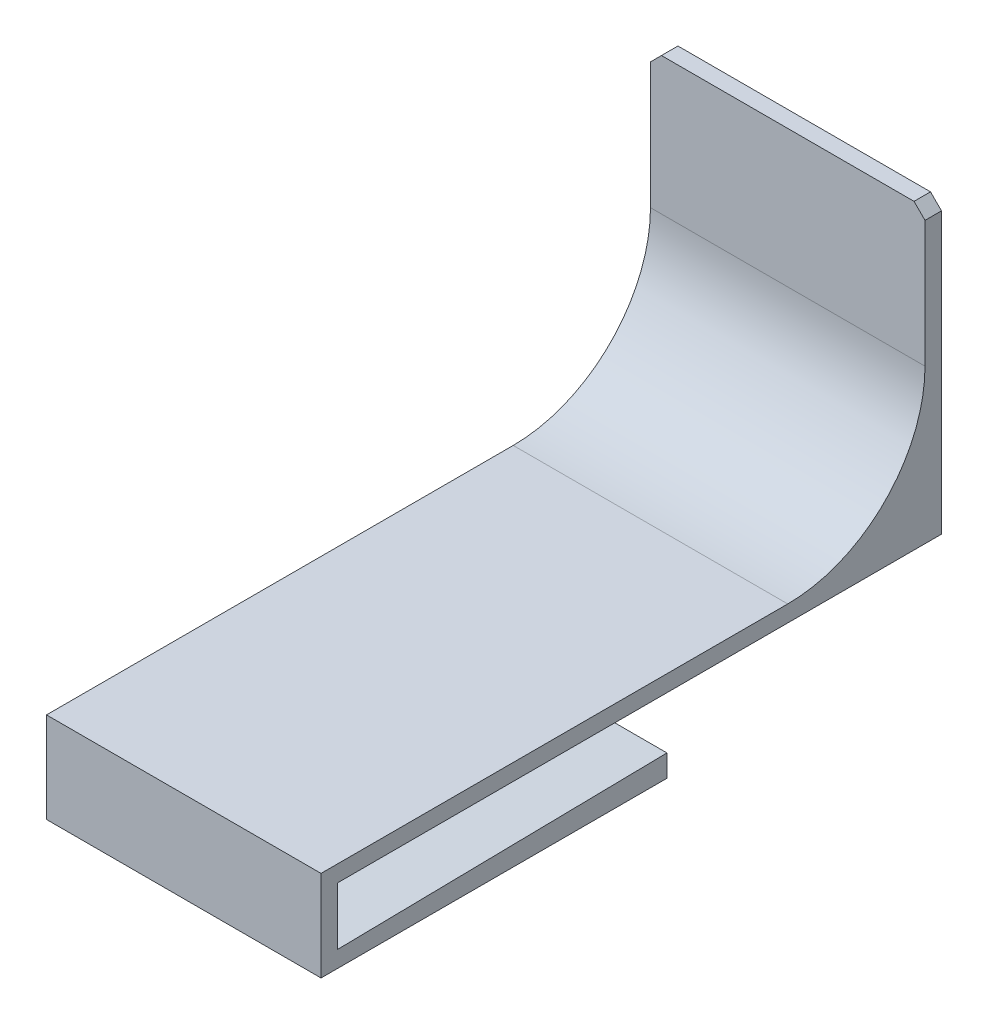
ISO-10303-21;
HEADER;
FILE_DESCRIPTION(('STEP AP214'),'2;1');
FILE_NAME('part.step','',(''),(''),'','','');
FILE_SCHEMA(('AUTOMOTIVE_DESIGN { 1 0 10303 214 1 1 1 1 }'));
ENDSEC;
DATA;
#1=APPLICATION_CONTEXT('core data for automotive mechanical design processes');
#2=APPLICATION_PROTOCOL_DEFINITION('international standard','automotive_design',2000,#1);
#3=PRODUCT_CONTEXT('',#1,'mechanical');
#4=PRODUCT('Part','Part','',(#3));
#5=PRODUCT_RELATED_PRODUCT_CATEGORY('part','',(#4));
#6=PRODUCT_DEFINITION_FORMATION('','',#4);
#7=PRODUCT_DEFINITION_CONTEXT('part definition',#1,'design');
#8=PRODUCT_DEFINITION('design','',#6,#7);
#9=PRODUCT_DEFINITION_SHAPE('','',#8);
#10=(LENGTH_UNIT() NAMED_UNIT(*) SI_UNIT(.MILLI.,.METRE.));
#11=(NAMED_UNIT(*) PLANE_ANGLE_UNIT() SI_UNIT($,.RADIAN.));
#12=(NAMED_UNIT(*) SI_UNIT($,.STERADIAN.) SOLID_ANGLE_UNIT());
#13=UNCERTAINTY_MEASURE_WITH_UNIT(LENGTH_MEASURE(1.E-05),#10,'distance_accuracy_value','');
#14=(GEOMETRIC_REPRESENTATION_CONTEXT(3) GLOBAL_UNCERTAINTY_ASSIGNED_CONTEXT((#13)) GLOBAL_UNIT_ASSIGNED_CONTEXT((#10,
#11,#12)) REPRESENTATION_CONTEXT('',''));
#15=CARTESIAN_POINT('',(0.,0.,0.));
#16=DIRECTION('',(0.,0.,1.));
#17=DIRECTION('',(1.,0.,0.));
#18=AXIS2_PLACEMENT_3D('',#15,#16,#17);
#19=CARTESIAN_POINT('',(25.,3.99999999999999,0.));
#20=DIRECTION('',(0.,0.,1.));
#21=DIRECTION('',(1.,0.,0.));
#22=AXIS2_PLACEMENT_3D('',#19,#20,#21);
#23=PLANE('',#22);
#24=DIRECTION('',(0.,1.,0.));
#25=VECTOR('',#24,1.);
#26=CARTESIAN_POINT('',(-25.,3.99999999999999,0.));
#27=LINE('',#26,#25);
#28=CARTESIAN_POINT('',(-25.,0.,0.));
#29=VERTEX_POINT('',#28);
#30=CARTESIAN_POINT('',(-25.,3.99999999999999,0.));
#31=VERTEX_POINT('',#30);
#32=EDGE_CURVE('E155',#29,#31,#27,.T.);
#33=ORIENTED_EDGE('',*,*,#32,.T.);
#34=DIRECTION('',(-1.,0.,0.));
#35=VECTOR('',#34,1.);
#36=CARTESIAN_POINT('',(25.,3.99999999999999,0.));
#37=LINE('',#36,#35);
#38=CARTESIAN_POINT('',(25.,3.99999999999999,0.));
#39=VERTEX_POINT('',#38);
#40=EDGE_CURVE('E154',#39,#31,#37,.T.);
#41=ORIENTED_EDGE('',*,*,#40,.F.);
#42=DIRECTION('',(0.,1.,0.));
#43=VECTOR('',#42,1.);
#44=CARTESIAN_POINT('',(25.,0.,0.));
#45=LINE('',#44,#43);
#46=CARTESIAN_POINT('',(25.,0.,0.));
#47=VERTEX_POINT('',#46);
#48=EDGE_CURVE('E139',#47,#39,#45,.T.);
#49=ORIENTED_EDGE('',*,*,#48,.F.);
#50=DIRECTION('',(-1.,0.,0.));
#51=VECTOR('',#50,1.);
#52=CARTESIAN_POINT('',(25.,0.,0.));
#53=LINE('',#52,#51);
#54=EDGE_CURVE('E193',#47,#29,#53,.T.);
#55=ORIENTED_EDGE('',*,*,#54,.T.);
#56=EDGE_LOOP('',(#33,#41,#49,#55));
#57=FACE_BOUND('',#56,.T.);
#58=ADVANCED_FACE('F39',(#57),#23,.F.);
#59=CARTESIAN_POINT('',(25.,2.99999999999999,60.));
#60=DIRECTION('',(0.,-0.9998611400396,-0.0166643523339933));
#61=DIRECTION('',(0.,0.0166643523339933,-0.9998611400396));
#62=AXIS2_PLACEMENT_3D('',#59,#60,#61);
#63=PLANE('',#62);
#64=DIRECTION('',(0.,-0.0166643523339933,0.9998611400396));
#65=VECTOR('',#64,1.);
#66=CARTESIAN_POINT('',(-25.,2.99999999999999,60.));
#67=LINE('',#66,#65);
#68=CARTESIAN_POINT('',(-25.,2.99999999999999,60.));
#69=VERTEX_POINT('',#68);
#70=EDGE_CURVE('E195',#31,#69,#67,.T.);
#71=ORIENTED_EDGE('',*,*,#70,.T.);
#72=DIRECTION('',(-1.,0.,0.));
#73=VECTOR('',#72,1.);
#74=CARTESIAN_POINT('',(25.,2.99999999999999,60.));
#75=LINE('',#74,#73);
#76=CARTESIAN_POINT('',(25.,2.99999999999999,60.));
#77=VERTEX_POINT('',#76);
#78=EDGE_CURVE('E160',#77,#69,#75,.T.);
#79=ORIENTED_EDGE('',*,*,#78,.F.);
#80=DIRECTION('',(0.,-0.0166643523339933,0.9998611400396));
#81=VECTOR('',#80,1.);
#82=CARTESIAN_POINT('',(25.,2.99999999999999,60.));
#83=LINE('',#82,#81);
#84=EDGE_CURVE('E143',#39,#77,#83,.T.);
#85=ORIENTED_EDGE('',*,*,#84,.F.);
#86=ORIENTED_EDGE('',*,*,#40,.T.);
#87=EDGE_LOOP('',(#71,#79,#85,#86));
#88=FACE_BOUND('',#87,.T.);
#89=ADVANCED_FACE('F162',(#88),#63,.F.);
#90=CARTESIAN_POINT('',(25.,2.99999999999999,60.));
#91=DIRECTION('',(0.,0.,1.));
#92=DIRECTION('',(1.,0.,0.));
#93=AXIS2_PLACEMENT_3D('',#90,#91,#92);
#94=PLANE('',#93);
#95=DIRECTION('',(0.,1.,0.));
#96=VECTOR('',#95,1.);
#97=CARTESIAN_POINT('',(-25.,2.99999999999999,60.));
#98=LINE('',#97,#96);
#99=CARTESIAN_POINT('',(-25.,13.5,60.));
#100=VERTEX_POINT('',#99);
#101=EDGE_CURVE('E198',#69,#100,#98,.T.);
#102=ORIENTED_EDGE('',*,*,#101,.T.);
#103=DIRECTION('',(-1.,0.,0.));
#104=VECTOR('',#103,1.);
#105=CARTESIAN_POINT('',(25.,13.5,60.));
#106=LINE('',#105,#104);
#107=CARTESIAN_POINT('',(25.,13.5,60.));
#108=VERTEX_POINT('',#107);
#109=EDGE_CURVE('E252',#108,#100,#106,.T.);
#110=ORIENTED_EDGE('',*,*,#109,.F.);
#111=DIRECTION('',(0.,1.,0.));
#112=VECTOR('',#111,1.);
#113=CARTESIAN_POINT('',(25.,2.99999999999999,60.));
#114=LINE('',#113,#112);
#115=EDGE_CURVE('E166',#77,#108,#114,.T.);
#116=ORIENTED_EDGE('',*,*,#115,.F.);
#117=ORIENTED_EDGE('',*,*,#78,.T.);
#118=EDGE_LOOP('',(#102,#110,#116,#117));
#119=FACE_BOUND('',#118,.T.);
#120=ADVANCED_FACE('F311',(#119),#94,.F.);
#121=CARTESIAN_POINT('',(25.,13.5,60.));
#122=DIRECTION('',(0.,1.,0.));
#123=DIRECTION('',(0.,0.,1.));
#124=AXIS2_PLACEMENT_3D('',#121,#122,#123);
#125=PLANE('',#124);
#126=DIRECTION('',(0.,0.,-1.));
#127=VECTOR('',#126,1.);
#128=CARTESIAN_POINT('',(-25.,13.5,60.));
#129=LINE('',#128,#127);
#130=CARTESIAN_POINT('',(-25.,13.5,-50.));
#131=VERTEX_POINT('',#130);
#132=EDGE_CURVE('E201',#100,#131,#129,.T.);
#133=ORIENTED_EDGE('',*,*,#132,.T.);
#134=DIRECTION('',(-1.,0.,0.));
#135=VECTOR('',#134,1.);
#136=CARTESIAN_POINT('',(25.,13.5,-50.));
#137=LINE('',#136,#135);
#138=CARTESIAN_POINT('',(25.,13.5,-50.));
#139=VERTEX_POINT('',#138);
#140=EDGE_CURVE('E248',#139,#131,#137,.T.);
#141=ORIENTED_EDGE('',*,*,#140,.F.);
#142=DIRECTION('',(0.,0.,-1.));
#143=VECTOR('',#142,1.);
#144=CARTESIAN_POINT('',(25.,13.5,60.));
#145=LINE('',#144,#143);
#146=EDGE_CURVE('E171',#108,#139,#145,.T.);
#147=ORIENTED_EDGE('',*,*,#146,.F.);
#148=ORIENTED_EDGE('',*,*,#109,.T.);
#149=EDGE_LOOP('',(#133,#141,#147,#148));
#150=FACE_BOUND('',#149,.T.);
#151=ADVANCED_FACE('F321',(#150),#125,.F.);
#152=CARTESIAN_POINT('',(25.,13.5,-50.));
#153=DIRECTION('',(0.,0.,1.));
#154=DIRECTION('',(1.,0.,0.));
#155=AXIS2_PLACEMENT_3D('',#152,#153,#154);
#156=PLANE('',#155);
#157=DIRECTION('',(0.,1.,0.));
#158=VECTOR('',#157,1.);
#159=CARTESIAN_POINT('',(-25.,13.5,-50.));
#160=LINE('',#159,#158);
#161=CARTESIAN_POINT('',(-25.,64.5,-50.));
#162=VERTEX_POINT('',#161);
#163=EDGE_CURVE('E204',#131,#162,#160,.T.);
#164=ORIENTED_EDGE('',*,*,#163,.T.);
#165=DIRECTION('',(-0.707106781186547,-0.707106781186548,0.));
#166=VECTOR('',#165,1.);
#167=CARTESIAN_POINT('',(-23.,66.5,-50.));
#168=LINE('',#167,#166);
#169=CARTESIAN_POINT('',(-23.,66.5,-50.));
#170=VERTEX_POINT('',#169);
#171=EDGE_CURVE('E49',#162,#170,#168,.F.);
#172=ORIENTED_EDGE('',*,*,#171,.T.);
#173=DIRECTION('',(-1.,0.,0.));
#174=VECTOR('',#173,1.);
#175=CARTESIAN_POINT('',(25.,66.5,-50.));
#176=LINE('',#175,#174);
#177=CARTESIAN_POINT('',(23.,66.5,-50.));
#178=VERTEX_POINT('',#177);
#179=EDGE_CURVE('E244',#178,#170,#176,.T.);
#180=ORIENTED_EDGE('',*,*,#179,.F.);
#181=DIRECTION('',(0.707106781186554,-0.707106781186541,0.));
#182=VECTOR('',#181,1.);
#183=CARTESIAN_POINT('',(24.9999999999999,64.5000000000001,-50.));
#184=LINE('',#183,#182);
#185=CARTESIAN_POINT('',(25.,64.5,-50.));
#186=VERTEX_POINT('',#185);
#187=EDGE_CURVE('E56',#178,#186,#184,.T.);
#188=ORIENTED_EDGE('',*,*,#187,.T.);
#189=DIRECTION('',(0.,1.,0.));
#190=VECTOR('',#189,1.);
#191=CARTESIAN_POINT('',(25.,13.5,-50.));
#192=LINE('',#191,#190);
#193=EDGE_CURVE('E176',#139,#186,#192,.T.);
#194=ORIENTED_EDGE('',*,*,#193,.F.);
#195=ORIENTED_EDGE('',*,*,#140,.T.);
#196=EDGE_LOOP('',(#164,#172,#180,#188,#194,#195));
#197=FACE_BOUND('',#196,.T.);
#198=ADVANCED_FACE('F274',(#197),#156,.F.);
#199=CARTESIAN_POINT('',(25.,66.5,-50.));
#200=DIRECTION('',(0.,-1.,0.));
#201=DIRECTION('',(0.,0.,-1.));
#202=AXIS2_PLACEMENT_3D('',#199,#200,#201);
#203=PLANE('',#202);
#204=ORIENTED_EDGE('',*,*,#179,.T.);
#205=DIRECTION('',(0.,0.,1.));
#206=VECTOR('',#205,1.);
#207=CARTESIAN_POINT('',(-23.,66.5,-50.));
#208=LINE('',#207,#206);
#209=CARTESIAN_POINT('',(-23.,66.5,-47.));
#210=VERTEX_POINT('',#209);
#211=EDGE_CURVE('E259',#170,#210,#208,.T.);
#212=ORIENTED_EDGE('',*,*,#211,.T.);
#213=DIRECTION('',(-1.,0.,0.));
#214=VECTOR('',#213,1.);
#215=CARTESIAN_POINT('',(25.,66.5,-47.));
#216=LINE('',#215,#214);
#217=CARTESIAN_POINT('',(23.,66.5,-47.));
#218=VERTEX_POINT('',#217);
#219=EDGE_CURVE('E240',#218,#210,#216,.T.);
#220=ORIENTED_EDGE('',*,*,#219,.F.);
#221=DIRECTION('',(0.,0.,-1.));
#222=VECTOR('',#221,1.);
#223=CARTESIAN_POINT('',(23.,66.5,-50.));
#224=LINE('',#223,#222);
#225=EDGE_CURVE('E159',#218,#178,#224,.T.);
#226=ORIENTED_EDGE('',*,*,#225,.T.);
#227=EDGE_LOOP('',(#204,#212,#220,#226));
#228=FACE_BOUND('',#227,.T.);
#229=ADVANCED_FACE('F278',(#228),#203,.F.);
#230=CARTESIAN_POINT('',(25.,41.5,-47.));
#231=DIRECTION('',(0.,0.,-1.));
#232=DIRECTION('',(-1.,0.,0.));
#233=AXIS2_PLACEMENT_3D('',#230,#231,#232);
#234=PLANE('',#233);
#235=ORIENTED_EDGE('',*,*,#219,.T.);
#236=DIRECTION('',(0.707106781186547,0.707106781186548,0.));
#237=VECTOR('',#236,1.);
#238=CARTESIAN_POINT('',(-23.,66.5,-47.));
#239=LINE('',#238,#237);
#240=CARTESIAN_POINT('',(-25.,64.5,-47.));
#241=VERTEX_POINT('',#240);
#242=EDGE_CURVE('E266',#210,#241,#239,.F.);
#243=ORIENTED_EDGE('',*,*,#242,.T.);
#244=DIRECTION('',(0.,-1.,0.));
#245=VECTOR('',#244,1.);
#246=CARTESIAN_POINT('',(-25.,41.5,-47.));
#247=LINE('',#246,#245);
#248=CARTESIAN_POINT('',(-25.,41.5,-47.));
#249=VERTEX_POINT('',#248);
#250=EDGE_CURVE('E207',#241,#249,#247,.T.);
#251=ORIENTED_EDGE('',*,*,#250,.T.);
#252=DIRECTION('',(-1.,0.,0.));
#253=VECTOR('',#252,1.);
#254=CARTESIAN_POINT('',(25.,41.5,-47.));
#255=LINE('',#254,#253);
#256=CARTESIAN_POINT('',(25.,41.5,-47.));
#257=VERTEX_POINT('',#256);
#258=EDGE_CURVE('E236',#257,#249,#255,.T.);
#259=ORIENTED_EDGE('',*,*,#258,.F.);
#260=DIRECTION('',(0.,-1.,0.));
#261=VECTOR('',#260,1.);
#262=CARTESIAN_POINT('',(25.,41.5,-47.));
#263=LINE('',#262,#261);
#264=CARTESIAN_POINT('',(25.,64.5,-47.));
#265=VERTEX_POINT('',#264);
#266=EDGE_CURVE('E179',#265,#257,#263,.T.);
#267=ORIENTED_EDGE('',*,*,#266,.F.);
#268=DIRECTION('',(-0.707106781186554,0.707106781186541,0.));
#269=VECTOR('',#268,1.);
#270=CARTESIAN_POINT('',(24.9999999999999,64.5000000000001,-47.));
#271=LINE('',#270,#269);
#272=EDGE_CURVE('E263',#265,#218,#271,.T.);
#273=ORIENTED_EDGE('',*,*,#272,.T.);
#274=EDGE_LOOP('',(#235,#243,#251,#259,#267,#273));
#275=FACE_BOUND('',#274,.T.);
#276=ADVANCED_FACE('F283',(#275),#234,.F.);
#277=CARTESIAN_POINT('',(25.,41.5,-22.));
#278=DIRECTION('',(-1.,0.,0.));
#279=DIRECTION('',(0.,0.,1.));
#280=AXIS2_PLACEMENT_3D('',#277,#278,#279);
#281=CYLINDRICAL_SURFACE('',#280,25.);
#282=CARTESIAN_POINT('',(-25.,41.5,-22.));
#283=DIRECTION('',(-1.,0.,0.));
#284=DIRECTION('',(0.,0.,-1.));
#285=AXIS2_PLACEMENT_3D('',#282,#283,#284);
#286=CIRCLE('',#285,25.);
#287=CARTESIAN_POINT('',(-25.,16.5,-22.));
#288=VERTEX_POINT('',#287);
#289=EDGE_CURVE('E210',#249,#288,#286,.T.);
#290=ORIENTED_EDGE('',*,*,#289,.T.);
#291=DIRECTION('',(-1.,0.,0.));
#292=VECTOR('',#291,1.);
#293=CARTESIAN_POINT('',(25.,16.5,-22.));
#294=LINE('',#293,#292);
#295=CARTESIAN_POINT('',(25.,16.5,-22.));
#296=VERTEX_POINT('',#295);
#297=EDGE_CURVE('E232',#296,#288,#294,.T.);
#298=ORIENTED_EDGE('',*,*,#297,.F.);
#299=CARTESIAN_POINT('',(25.,41.5,-22.));
#300=DIRECTION('',(-1.,0.,0.));
#301=DIRECTION('',(0.,0.,-1.));
#302=AXIS2_PLACEMENT_3D('',#299,#300,#301);
#303=CIRCLE('',#302,25.);
#304=EDGE_CURVE('E182',#257,#296,#303,.T.);
#305=ORIENTED_EDGE('',*,*,#304,.F.);
#306=ORIENTED_EDGE('',*,*,#258,.T.);
#307=EDGE_LOOP('',(#290,#298,#305,#306));
#308=FACE_BOUND('',#307,.T.);
#309=ADVANCED_FACE('F291',(#308),#281,.F.);
#310=CARTESIAN_POINT('',(25.,16.5,63.));
#311=DIRECTION('',(0.,-1.,0.));
#312=DIRECTION('',(0.,0.,-1.));
#313=AXIS2_PLACEMENT_3D('',#310,#311,#312);
#314=PLANE('',#313);
#315=DIRECTION('',(0.,0.,1.));
#316=VECTOR('',#315,1.);
#317=CARTESIAN_POINT('',(-25.,16.5,63.));
#318=LINE('',#317,#316);
#319=CARTESIAN_POINT('',(-25.,16.5,63.));
#320=VERTEX_POINT('',#319);
#321=EDGE_CURVE('E213',#288,#320,#318,.T.);
#322=ORIENTED_EDGE('',*,*,#321,.T.);
#323=DIRECTION('',(-1.,0.,0.));
#324=VECTOR('',#323,1.);
#325=CARTESIAN_POINT('',(25.,16.5,63.));
#326=LINE('',#325,#324);
#327=CARTESIAN_POINT('',(25.,16.5,63.));
#328=VERTEX_POINT('',#327);
#329=EDGE_CURVE('E228',#328,#320,#326,.T.);
#330=ORIENTED_EDGE('',*,*,#329,.F.);
#331=DIRECTION('',(0.,0.,1.));
#332=VECTOR('',#331,1.);
#333=CARTESIAN_POINT('',(25.,16.5,63.));
#334=LINE('',#333,#332);
#335=EDGE_CURVE('E185',#296,#328,#334,.T.);
#336=ORIENTED_EDGE('',*,*,#335,.F.);
#337=ORIENTED_EDGE('',*,*,#297,.T.);
#338=EDGE_LOOP('',(#322,#330,#336,#337));
#339=FACE_BOUND('',#338,.T.);
#340=ADVANCED_FACE('F295',(#339),#314,.F.);
#341=CARTESIAN_POINT('',(25.,0.,63.));
#342=DIRECTION('',(0.,0.,-1.));
#343=DIRECTION('',(-1.,0.,0.));
#344=AXIS2_PLACEMENT_3D('',#341,#342,#343);
#345=PLANE('',#344);
#346=DIRECTION('',(0.,-1.,0.));
#347=VECTOR('',#346,1.);
#348=CARTESIAN_POINT('',(-25.,0.,63.));
#349=LINE('',#348,#347);
#350=CARTESIAN_POINT('',(-25.,0.,63.));
#351=VERTEX_POINT('',#350);
#352=EDGE_CURVE('E216',#320,#351,#349,.T.);
#353=ORIENTED_EDGE('',*,*,#352,.T.);
#354=DIRECTION('',(-1.,0.,0.));
#355=VECTOR('',#354,1.);
#356=CARTESIAN_POINT('',(25.,0.,63.));
#357=LINE('',#356,#355);
#358=CARTESIAN_POINT('',(25.,0.,63.));
#359=VERTEX_POINT('',#358);
#360=EDGE_CURVE('E224',#359,#351,#357,.T.);
#361=ORIENTED_EDGE('',*,*,#360,.F.);
#362=DIRECTION('',(0.,-1.,0.));
#363=VECTOR('',#362,1.);
#364=CARTESIAN_POINT('',(25.,0.,63.));
#365=LINE('',#364,#363);
#366=EDGE_CURVE('E188',#328,#359,#365,.T.);
#367=ORIENTED_EDGE('',*,*,#366,.F.);
#368=ORIENTED_EDGE('',*,*,#329,.T.);
#369=EDGE_LOOP('',(#353,#361,#367,#368));
#370=FACE_BOUND('',#369,.T.);
#371=ADVANCED_FACE('F336',(#370),#345,.F.);
#372=CARTESIAN_POINT('',(25.,0.,0.));
#373=DIRECTION('',(0.,1.,0.));
#374=DIRECTION('',(0.,0.,1.));
#375=AXIS2_PLACEMENT_3D('',#372,#373,#374);
#376=PLANE('',#375);
#377=DIRECTION('',(0.,0.,-1.));
#378=VECTOR('',#377,1.);
#379=CARTESIAN_POINT('',(-25.,0.,0.));
#380=LINE('',#379,#378);
#381=EDGE_CURVE('E151',#351,#29,#380,.T.);
#382=ORIENTED_EDGE('',*,*,#381,.T.);
#383=ORIENTED_EDGE('',*,*,#54,.F.);
#384=DIRECTION('',(0.,0.,-1.));
#385=VECTOR('',#384,1.);
#386=CARTESIAN_POINT('',(25.,0.,0.));
#387=LINE('',#386,#385);
#388=EDGE_CURVE('E146',#359,#47,#387,.T.);
#389=ORIENTED_EDGE('',*,*,#388,.F.);
#390=ORIENTED_EDGE('',*,*,#360,.T.);
#391=EDGE_LOOP('',(#382,#383,#389,#390));
#392=FACE_BOUND('',#391,.T.);
#393=ADVANCED_FACE('F339',(#392),#376,.F.);
#394=CARTESIAN_POINT('',(25.,41.5,-22.));
#395=DIRECTION('',(1.,0.,0.));
#396=DIRECTION('',(0.,0.,-1.));
#397=AXIS2_PLACEMENT_3D('',#394,#395,#396);
#398=PLANE('',#397);
#399=ORIENTED_EDGE('',*,*,#193,.T.);
#400=DIRECTION('',(0.,0.,1.));
#401=VECTOR('',#400,1.);
#402=CARTESIAN_POINT('',(25.,64.5,-47.));
#403=LINE('',#402,#401);
#404=EDGE_CURVE('E11',#186,#265,#403,.T.);
#405=ORIENTED_EDGE('',*,*,#404,.T.);
#406=ORIENTED_EDGE('',*,*,#266,.T.);
#407=ORIENTED_EDGE('',*,*,#304,.T.);
#408=ORIENTED_EDGE('',*,*,#335,.T.);
#409=ORIENTED_EDGE('',*,*,#366,.T.);
#410=ORIENTED_EDGE('',*,*,#388,.T.);
#411=ORIENTED_EDGE('',*,*,#48,.T.);
#412=ORIENTED_EDGE('',*,*,#84,.T.);
#413=ORIENTED_EDGE('',*,*,#115,.T.);
#414=ORIENTED_EDGE('',*,*,#146,.T.);
#415=EDGE_LOOP('',(#399,#405,#406,#407,#408,#409,#410,#411,#412,#413,#414));
#416=FACE_BOUND('',#415,.T.);
#417=ADVANCED_FACE('F141',(#416),#398,.T.);
#418=CARTESIAN_POINT('',(-25.,41.5,-22.));
#419=DIRECTION('',(1.,0.,0.));
#420=DIRECTION('',(0.,0.,-1.));
#421=AXIS2_PLACEMENT_3D('',#418,#419,#420);
#422=PLANE('',#421);
#423=ORIENTED_EDGE('',*,*,#250,.F.);
#424=DIRECTION('',(0.,0.,-1.));
#425=VECTOR('',#424,1.);
#426=CARTESIAN_POINT('',(-25.,64.5000000000001,-22.0000000000001));
#427=LINE('',#426,#425);
#428=EDGE_CURVE('E64',#241,#162,#427,.T.);
#429=ORIENTED_EDGE('',*,*,#428,.T.);
#430=ORIENTED_EDGE('',*,*,#163,.F.);
#431=ORIENTED_EDGE('',*,*,#132,.F.);
#432=ORIENTED_EDGE('',*,*,#101,.F.);
#433=ORIENTED_EDGE('',*,*,#70,.F.);
#434=ORIENTED_EDGE('',*,*,#32,.F.);
#435=ORIENTED_EDGE('',*,*,#381,.F.);
#436=ORIENTED_EDGE('',*,*,#352,.F.);
#437=ORIENTED_EDGE('',*,*,#321,.F.);
#438=ORIENTED_EDGE('',*,*,#289,.F.);
#439=EDGE_LOOP('',(#423,#429,#430,#431,#432,#433,#434,#435,#436,#437,#438));
#440=FACE_BOUND('',#439,.T.);
#441=ADVANCED_FACE('F286',(#440),#422,.F.);
#442=CARTESIAN_POINT('',(-23.,66.5,-50.));
#443=DIRECTION('',(0.707106781186548,-0.707106781186547,0.));
#444=DIRECTION('',(0.,0.,1.));
#445=AXIS2_PLACEMENT_3D('',#442,#443,#444);
#446=PLANE('',#445);
#447=ORIENTED_EDGE('',*,*,#171,.F.);
#448=ORIENTED_EDGE('',*,*,#428,.F.);
#449=ORIENTED_EDGE('',*,*,#242,.F.);
#450=ORIENTED_EDGE('',*,*,#211,.F.);
#451=EDGE_LOOP('',(#447,#448,#449,#450));
#452=FACE_BOUND('',#451,.T.);
#453=ADVANCED_FACE('F281',(#452),#446,.F.);
#454=CARTESIAN_POINT('',(25.,64.5000000000002,-22.0000000000001));
#455=DIRECTION('',(0.707106781186541,0.707106781186554,0.));
#456=DIRECTION('',(0.,0.,-1.));
#457=AXIS2_PLACEMENT_3D('',#454,#455,#456);
#458=PLANE('',#457);
#459=ORIENTED_EDGE('',*,*,#187,.F.);
#460=ORIENTED_EDGE('',*,*,#225,.F.);
#461=ORIENTED_EDGE('',*,*,#272,.F.);
#462=ORIENTED_EDGE('',*,*,#404,.F.);
#463=EDGE_LOOP('',(#459,#460,#461,#462));
#464=FACE_BOUND('',#463,.T.);
#465=ADVANCED_FACE('F42',(#464),#458,.T.);
#466=CLOSED_SHELL('',(#58,#89,#120,#151,#198,#229,#276,#309,#340,#371,#393,#417,#441,#453,#465));
#467=MANIFOLD_SOLID_BREP('B2',#466);
#468=ADVANCED_BREP_SHAPE_REPRESENTATION('',(#18,#467),#14);
#469=SHAPE_DEFINITION_REPRESENTATION(#9,#468);
ENDSEC;
END-ISO-10303-21;
